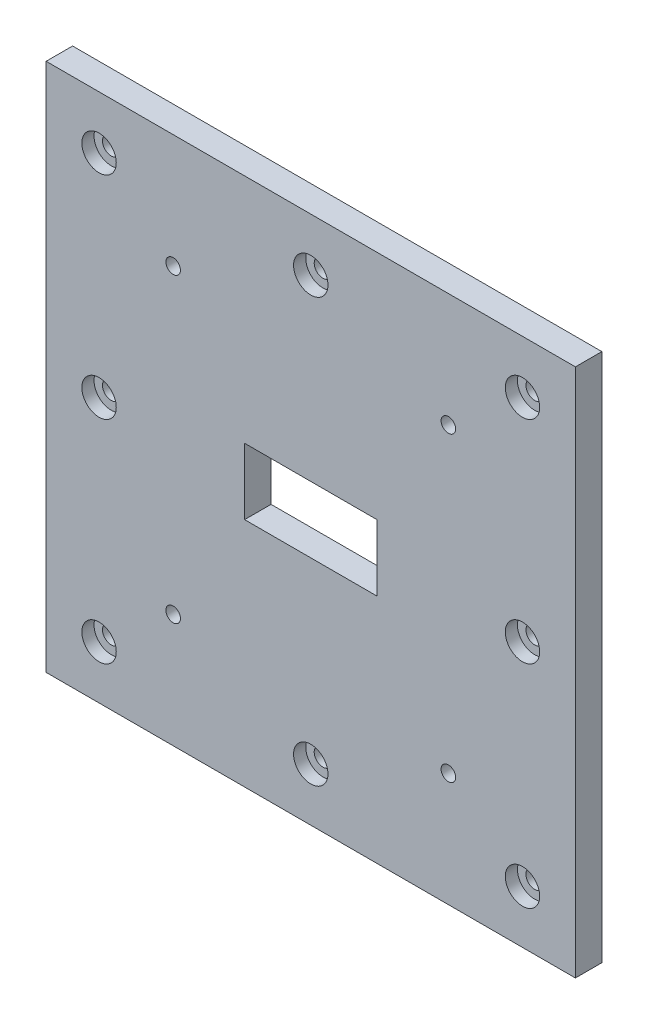
ISO-10303-21;
HEADER;
FILE_DESCRIPTION(('STEP AP214'),'2;1');
FILE_NAME('part.step','',(''),(''),'','','');
FILE_SCHEMA(('AUTOMOTIVE_DESIGN { 1 0 10303 214 1 1 1 1 }'));
ENDSEC;
DATA;
#1=APPLICATION_CONTEXT('core data for automotive mechanical design processes');
#2=APPLICATION_PROTOCOL_DEFINITION('international standard','automotive_design',2000,#1);
#3=PRODUCT_CONTEXT('',#1,'mechanical');
#4=PRODUCT('Part','Part','',(#3));
#5=PRODUCT_RELATED_PRODUCT_CATEGORY('part','',(#4));
#6=PRODUCT_DEFINITION_FORMATION('','',#4);
#7=PRODUCT_DEFINITION_CONTEXT('part definition',#1,'design');
#8=PRODUCT_DEFINITION('design','',#6,#7);
#9=PRODUCT_DEFINITION_SHAPE('','',#8);
#10=(LENGTH_UNIT() NAMED_UNIT(*) SI_UNIT(.MILLI.,.METRE.));
#11=(NAMED_UNIT(*) PLANE_ANGLE_UNIT() SI_UNIT($,.RADIAN.));
#12=(NAMED_UNIT(*) SI_UNIT($,.STERADIAN.) SOLID_ANGLE_UNIT());
#13=UNCERTAINTY_MEASURE_WITH_UNIT(LENGTH_MEASURE(1.E-05),#10,'distance_accuracy_value','');
#14=(GEOMETRIC_REPRESENTATION_CONTEXT(3) GLOBAL_UNCERTAINTY_ASSIGNED_CONTEXT((#13)) GLOBAL_UNIT_ASSIGNED_CONTEXT((#10,
#11,#12)) REPRESENTATION_CONTEXT('',''));
#15=CARTESIAN_POINT('',(0.,0.,0.));
#16=DIRECTION('',(0.,0.,1.));
#17=DIRECTION('',(1.,0.,0.));
#18=AXIS2_PLACEMENT_3D('',#15,#16,#17);
#19=CARTESIAN_POINT('',(0.,0.,5.));
#20=DIRECTION('',(0.,0.,1.));
#21=DIRECTION('',(1.,0.,0.));
#22=AXIS2_PLACEMENT_3D('',#19,#20,#21);
#23=PLANE('',#22);
#24=CARTESIAN_POINT('',(52.,57.,5.));
#25=DIRECTION('',(0.,0.,-1.));
#26=DIRECTION('',(-1.,0.,0.));
#27=AXIS2_PLACEMENT_3D('',#24,#25,#26);
#28=CIRCLE('',#27,2.75);
#29=CARTESIAN_POINT('',(49.25,57.,5.));
#30=VERTEX_POINT('',#29);
#31=EDGE_CURVE('E305',#30,#30,#28,.T.);
#32=ORIENTED_EDGE('',*,*,#31,.T.);
#33=EDGE_LOOP('',(#32));
#34=FACE_BOUND('',#33,.T.);
#35=CARTESIAN_POINT('',(-52.,57.,5.));
#36=DIRECTION('',(0.,0.,-1.));
#37=DIRECTION('',(-1.,0.,0.));
#38=AXIS2_PLACEMENT_3D('',#35,#36,#37);
#39=CIRCLE('',#38,2.75);
#40=CARTESIAN_POINT('',(-54.75,57.,5.));
#41=VERTEX_POINT('',#40);
#42=EDGE_CURVE('E296',#41,#41,#39,.T.);
#43=ORIENTED_EDGE('',*,*,#42,.T.);
#44=EDGE_LOOP('',(#43));
#45=FACE_BOUND('',#44,.T.);
#46=CARTESIAN_POINT('',(-51.9999999999999,-57.,5.));
#47=DIRECTION('',(0.,0.,-1.));
#48=DIRECTION('',(-1.,0.,0.));
#49=AXIS2_PLACEMENT_3D('',#46,#47,#48);
#50=CIRCLE('',#49,2.75);
#51=CARTESIAN_POINT('',(-54.7499999999999,-57.,5.));
#52=VERTEX_POINT('',#51);
#53=EDGE_CURVE('E287',#52,#52,#50,.T.);
#54=ORIENTED_EDGE('',*,*,#53,.T.);
#55=EDGE_LOOP('',(#54));
#56=FACE_BOUND('',#55,.T.);
#57=DIRECTION('',(0.,-1.,0.));
#58=VECTOR('',#57,1.);
#59=CARTESIAN_POINT('',(-100.,-100.,5.));
#60=LINE('',#59,#58);
#61=CARTESIAN_POINT('',(-100.,100.,5.));
#62=VERTEX_POINT('',#61);
#63=CARTESIAN_POINT('',(-100.,-100.,5.));
#64=VERTEX_POINT('',#63);
#65=EDGE_CURVE('E137',#62,#64,#60,.T.);
#66=ORIENTED_EDGE('',*,*,#65,.T.);
#67=DIRECTION('',(1.,0.,0.));
#68=VECTOR('',#67,1.);
#69=CARTESIAN_POINT('',(100.,-100.,5.));
#70=LINE('',#69,#68);
#71=CARTESIAN_POINT('',(100.,-100.,5.));
#72=VERTEX_POINT('',#71);
#73=EDGE_CURVE('E142',#64,#72,#70,.T.);
#74=ORIENTED_EDGE('',*,*,#73,.T.);
#75=DIRECTION('',(0.,1.,0.));
#76=VECTOR('',#75,1.);
#77=CARTESIAN_POINT('',(100.,-100.,5.));
#78=LINE('',#77,#76);
#79=CARTESIAN_POINT('',(100.,100.,5.));
#80=VERTEX_POINT('',#79);
#81=EDGE_CURVE('E145',#72,#80,#78,.T.);
#82=ORIENTED_EDGE('',*,*,#81,.T.);
#83=DIRECTION('',(-1.,0.,0.));
#84=VECTOR('',#83,1.);
#85=CARTESIAN_POINT('',(100.,100.,5.));
#86=LINE('',#85,#84);
#87=EDGE_CURVE('E148',#80,#62,#86,.T.);
#88=ORIENTED_EDGE('',*,*,#87,.T.);
#89=EDGE_LOOP('',(#66,#74,#82,#88));
#90=FACE_BOUND('',#89,.T.);
#91=DIRECTION('',(0.,1.,0.));
#92=VECTOR('',#91,1.);
#93=CARTESIAN_POINT('',(25.,0.,5.));
#94=LINE('',#93,#92);
#95=CARTESIAN_POINT('',(25.,-12.5,5.));
#96=VERTEX_POINT('',#95);
#97=CARTESIAN_POINT('',(25.,12.5,5.));
#98=VERTEX_POINT('',#97);
#99=EDGE_CURVE('E13',#96,#98,#94,.T.);
#100=ORIENTED_EDGE('',*,*,#99,.F.);
#101=DIRECTION('',(1.,0.,0.));
#102=VECTOR('',#101,1.);
#103=CARTESIAN_POINT('',(0.,-12.5,5.));
#104=LINE('',#103,#102);
#105=CARTESIAN_POINT('',(-25.,-12.5,5.));
#106=VERTEX_POINT('',#105);
#107=EDGE_CURVE('E166',#106,#96,#104,.T.);
#108=ORIENTED_EDGE('',*,*,#107,.F.);
#109=DIRECTION('',(0.,-1.,0.));
#110=VECTOR('',#109,1.);
#111=CARTESIAN_POINT('',(-25.,0.,5.));
#112=LINE('',#111,#110);
#113=CARTESIAN_POINT('',(-25.,12.5,5.));
#114=VERTEX_POINT('',#113);
#115=EDGE_CURVE('E117',#114,#106,#112,.T.);
#116=ORIENTED_EDGE('',*,*,#115,.F.);
#117=DIRECTION('',(-1.,0.,0.));
#118=VECTOR('',#117,1.);
#119=CARTESIAN_POINT('',(0.,12.5,5.));
#120=LINE('',#119,#118);
#121=EDGE_CURVE('E55',#98,#114,#120,.T.);
#122=ORIENTED_EDGE('',*,*,#121,.F.);
#123=EDGE_LOOP('',(#100,#108,#116,#122));
#124=FACE_BOUND('',#123,.T.);
#125=CARTESIAN_POINT('',(-80.,80.,5.));
#126=DIRECTION('',(0.,0.,1.));
#127=DIRECTION('',(1.,0.,0.));
#128=AXIS2_PLACEMENT_3D('',#125,#126,#127);
#129=CIRCLE('',#128,6.49999999999999);
#130=CARTESIAN_POINT('',(-73.5,80.,5.));
#131=VERTEX_POINT('',#130);
#132=EDGE_CURVE('E191',#131,#131,#129,.T.);
#133=ORIENTED_EDGE('',*,*,#132,.F.);
#134=EDGE_LOOP('',(#133));
#135=FACE_BOUND('',#134,.T.);
#136=CARTESIAN_POINT('',(0.,-80.,5.));
#137=DIRECTION('',(0.,0.,1.));
#138=DIRECTION('',(1.,0.,0.));
#139=AXIS2_PLACEMENT_3D('',#136,#137,#138);
#140=CIRCLE('',#139,6.5);
#141=CARTESIAN_POINT('',(6.5,-80.,5.));
#142=VERTEX_POINT('',#141);
#143=EDGE_CURVE('E203',#142,#142,#140,.T.);
#144=ORIENTED_EDGE('',*,*,#143,.F.);
#145=EDGE_LOOP('',(#144));
#146=FACE_BOUND('',#145,.T.);
#147=CARTESIAN_POINT('',(0.,80.,5.));
#148=DIRECTION('',(0.,0.,1.));
#149=DIRECTION('',(1.,0.,0.));
#150=AXIS2_PLACEMENT_3D('',#147,#148,#149);
#151=CIRCLE('',#150,6.5);
#152=CARTESIAN_POINT('',(6.5,80.,5.));
#153=VERTEX_POINT('',#152);
#154=EDGE_CURVE('E215',#153,#153,#151,.T.);
#155=ORIENTED_EDGE('',*,*,#154,.F.);
#156=EDGE_LOOP('',(#155));
#157=FACE_BOUND('',#156,.T.);
#158=CARTESIAN_POINT('',(80.,-80.,5.));
#159=DIRECTION('',(0.,0.,1.));
#160=DIRECTION('',(1.,0.,0.));
#161=AXIS2_PLACEMENT_3D('',#158,#159,#160);
#162=CIRCLE('',#161,6.49999999999999);
#163=CARTESIAN_POINT('',(86.5,-80.,5.));
#164=VERTEX_POINT('',#163);
#165=EDGE_CURVE('E227',#164,#164,#162,.T.);
#166=ORIENTED_EDGE('',*,*,#165,.F.);
#167=EDGE_LOOP('',(#166));
#168=FACE_BOUND('',#167,.T.);
#169=CARTESIAN_POINT('',(80.,0.,5.));
#170=DIRECTION('',(0.,0.,1.));
#171=DIRECTION('',(1.,0.,0.));
#172=AXIS2_PLACEMENT_3D('',#169,#170,#171);
#173=CIRCLE('',#172,6.49999999999999);
#174=CARTESIAN_POINT('',(86.5,0.,5.));
#175=VERTEX_POINT('',#174);
#176=EDGE_CURVE('E239',#175,#175,#173,.T.);
#177=ORIENTED_EDGE('',*,*,#176,.F.);
#178=EDGE_LOOP('',(#177));
#179=FACE_BOUND('',#178,.T.);
#180=CARTESIAN_POINT('',(80.,80.,5.));
#181=DIRECTION('',(0.,0.,1.));
#182=DIRECTION('',(1.,0.,0.));
#183=AXIS2_PLACEMENT_3D('',#180,#181,#182);
#184=CIRCLE('',#183,6.49999999999999);
#185=CARTESIAN_POINT('',(86.5,80.,5.));
#186=VERTEX_POINT('',#185);
#187=EDGE_CURVE('E251',#186,#186,#184,.T.);
#188=ORIENTED_EDGE('',*,*,#187,.F.);
#189=EDGE_LOOP('',(#188));
#190=FACE_BOUND('',#189,.T.);
#191=CARTESIAN_POINT('',(-80.,-80.,5.));
#192=DIRECTION('',(0.,0.,1.));
#193=DIRECTION('',(1.,0.,0.));
#194=AXIS2_PLACEMENT_3D('',#191,#192,#193);
#195=CIRCLE('',#194,6.49999999999999);
#196=CARTESIAN_POINT('',(-73.5,-80.,5.));
#197=VERTEX_POINT('',#196);
#198=EDGE_CURVE('E263',#197,#197,#195,.T.);
#199=ORIENTED_EDGE('',*,*,#198,.F.);
#200=EDGE_LOOP('',(#199));
#201=FACE_BOUND('',#200,.T.);
#202=CARTESIAN_POINT('',(-80.,0.,5.));
#203=DIRECTION('',(0.,0.,1.));
#204=DIRECTION('',(1.,0.,0.));
#205=AXIS2_PLACEMENT_3D('',#202,#203,#204);
#206=CIRCLE('',#205,6.49999999999999);
#207=CARTESIAN_POINT('',(-73.5,0.,5.));
#208=VERTEX_POINT('',#207);
#209=EDGE_CURVE('E275',#208,#208,#206,.T.);
#210=ORIENTED_EDGE('',*,*,#209,.F.);
#211=EDGE_LOOP('',(#210));
#212=FACE_BOUND('',#211,.T.);
#213=CARTESIAN_POINT('',(52.,-56.9999999999999,5.));
#214=DIRECTION('',(0.,0.,-1.));
#215=DIRECTION('',(-1.,0.,0.));
#216=AXIS2_PLACEMENT_3D('',#213,#214,#215);
#217=CIRCLE('',#216,2.75);
#218=CARTESIAN_POINT('',(49.25,-56.9999999999999,5.));
#219=VERTEX_POINT('',#218);
#220=EDGE_CURVE('E278',#219,#219,#217,.T.);
#221=ORIENTED_EDGE('',*,*,#220,.T.);
#222=EDGE_LOOP('',(#221));
#223=FACE_BOUND('',#222,.T.);
#224=ADVANCED_FACE('F47',(#34,#45,#56,#90,#124,#135,#146,#157,#168,#179,#190,#201,#212,#223),
#23,.T.);
#225=CARTESIAN_POINT('',(-100.,-100.,-5.));
#226=DIRECTION('',(-1.,0.,0.));
#227=DIRECTION('',(0.,0.,1.));
#228=AXIS2_PLACEMENT_3D('',#225,#226,#227);
#229=PLANE('',#228);
#230=DIRECTION('',(0.,0.,1.));
#231=VECTOR('',#230,1.);
#232=CARTESIAN_POINT('',(-100.,-100.,-5.));
#233=LINE('',#232,#231);
#234=CARTESIAN_POINT('',(-100.,-100.,-5.));
#235=VERTEX_POINT('',#234);
#236=EDGE_CURVE('E163',#235,#64,#233,.T.);
#237=ORIENTED_EDGE('',*,*,#236,.T.);
#238=ORIENTED_EDGE('',*,*,#65,.F.);
#239=DIRECTION('',(0.,0.,1.));
#240=VECTOR('',#239,1.);
#241=CARTESIAN_POINT('',(-100.,100.,-5.));
#242=LINE('',#241,#240);
#243=CARTESIAN_POINT('',(-100.,100.,-5.));
#244=VERTEX_POINT('',#243);
#245=EDGE_CURVE('E164',#244,#62,#242,.T.);
#246=ORIENTED_EDGE('',*,*,#245,.F.);
#247=DIRECTION('',(0.,-1.,0.));
#248=VECTOR('',#247,1.);
#249=CARTESIAN_POINT('',(-100.,-100.,-5.));
#250=LINE('',#249,#248);
#251=EDGE_CURVE('E151',#244,#235,#250,.T.);
#252=ORIENTED_EDGE('',*,*,#251,.T.);
#253=EDGE_LOOP('',(#237,#238,#246,#252));
#254=FACE_BOUND('',#253,.T.);
#255=ADVANCED_FACE('F49',(#254),#229,.T.);
#256=CARTESIAN_POINT('',(100.,100.,-5.));
#257=DIRECTION('',(0.,1.,0.));
#258=DIRECTION('',(-1.,0.,0.));
#259=AXIS2_PLACEMENT_3D('',#256,#257,#258);
#260=PLANE('',#259);
#261=ORIENTED_EDGE('',*,*,#245,.T.);
#262=ORIENTED_EDGE('',*,*,#87,.F.);
#263=DIRECTION('',(0.,0.,1.));
#264=VECTOR('',#263,1.);
#265=CARTESIAN_POINT('',(100.,100.,-5.));
#266=LINE('',#265,#264);
#267=CARTESIAN_POINT('',(100.,100.,-5.));
#268=VERTEX_POINT('',#267);
#269=EDGE_CURVE('E167',#268,#80,#266,.T.);
#270=ORIENTED_EDGE('',*,*,#269,.F.);
#271=DIRECTION('',(-1.,0.,0.));
#272=VECTOR('',#271,1.);
#273=CARTESIAN_POINT('',(100.,100.,-5.));
#274=LINE('',#273,#272);
#275=EDGE_CURVE('E160',#268,#244,#274,.T.);
#276=ORIENTED_EDGE('',*,*,#275,.T.);
#277=EDGE_LOOP('',(#261,#262,#270,#276));
#278=FACE_BOUND('',#277,.T.);
#279=ADVANCED_FACE('F491',(#278),#260,.T.);
#280=CARTESIAN_POINT('',(100.,-100.,-5.));
#281=DIRECTION('',(1.,0.,0.));
#282=DIRECTION('',(0.,0.,-1.));
#283=AXIS2_PLACEMENT_3D('',#280,#281,#282);
#284=PLANE('',#283);
#285=ORIENTED_EDGE('',*,*,#269,.T.);
#286=ORIENTED_EDGE('',*,*,#81,.F.);
#287=DIRECTION('',(0.,0.,1.));
#288=VECTOR('',#287,1.);
#289=CARTESIAN_POINT('',(100.,-100.,-5.));
#290=LINE('',#289,#288);
#291=CARTESIAN_POINT('',(100.,-100.,-5.));
#292=VERTEX_POINT('',#291);
#293=EDGE_CURVE('E169',#292,#72,#290,.T.);
#294=ORIENTED_EDGE('',*,*,#293,.F.);
#295=DIRECTION('',(0.,1.,0.));
#296=VECTOR('',#295,1.);
#297=CARTESIAN_POINT('',(100.,-100.,-5.));
#298=LINE('',#297,#296);
#299=EDGE_CURVE('E157',#292,#268,#298,.T.);
#300=ORIENTED_EDGE('',*,*,#299,.T.);
#301=EDGE_LOOP('',(#285,#286,#294,#300));
#302=FACE_BOUND('',#301,.T.);
#303=ADVANCED_FACE('F494',(#302),#284,.T.);
#304=CARTESIAN_POINT('',(100.,-100.,-5.));
#305=DIRECTION('',(0.,-1.,0.));
#306=DIRECTION('',(1.,0.,0.));
#307=AXIS2_PLACEMENT_3D('',#304,#305,#306);
#308=PLANE('',#307);
#309=ORIENTED_EDGE('',*,*,#293,.T.);
#310=ORIENTED_EDGE('',*,*,#73,.F.);
#311=ORIENTED_EDGE('',*,*,#236,.F.);
#312=DIRECTION('',(1.,0.,0.));
#313=VECTOR('',#312,1.);
#314=CARTESIAN_POINT('',(100.,-100.,-5.));
#315=LINE('',#314,#313);
#316=EDGE_CURVE('E154',#235,#292,#315,.T.);
#317=ORIENTED_EDGE('',*,*,#316,.T.);
#318=EDGE_LOOP('',(#309,#310,#311,#317));
#319=FACE_BOUND('',#318,.T.);
#320=ADVANCED_FACE('F319',(#319),#308,.T.);
#321=CARTESIAN_POINT('',(0.,0.,-5.));
#322=DIRECTION('',(0.,0.,1.));
#323=DIRECTION('',(1.,0.,0.));
#324=AXIS2_PLACEMENT_3D('',#321,#322,#323);
#325=PLANE('',#324);
#326=CARTESIAN_POINT('',(52.,57.,-5.));
#327=DIRECTION('',(0.,0.,-1.));
#328=DIRECTION('',(-1.,0.,0.));
#329=AXIS2_PLACEMENT_3D('',#326,#327,#328);
#330=CIRCLE('',#329,5.6);
#331=CARTESIAN_POINT('',(46.4,57.,-5.));
#332=VERTEX_POINT('',#331);
#333=EDGE_CURVE('E311',#332,#332,#330,.T.);
#334=ORIENTED_EDGE('',*,*,#333,.F.);
#335=EDGE_LOOP('',(#334));
#336=FACE_BOUND('',#335,.T.);
#337=CARTESIAN_POINT('',(-52.,57.,-5.));
#338=DIRECTION('',(0.,0.,-1.));
#339=DIRECTION('',(-1.,0.,0.));
#340=AXIS2_PLACEMENT_3D('',#337,#338,#339);
#341=CIRCLE('',#340,5.6);
#342=CARTESIAN_POINT('',(-57.6,57.,-5.));
#343=VERTEX_POINT('',#342);
#344=EDGE_CURVE('E302',#343,#343,#341,.T.);
#345=ORIENTED_EDGE('',*,*,#344,.F.);
#346=EDGE_LOOP('',(#345));
#347=FACE_BOUND('',#346,.T.);
#348=CARTESIAN_POINT('',(-51.9999999999999,-57.,-5.));
#349=DIRECTION('',(0.,0.,-1.));
#350=DIRECTION('',(-1.,0.,0.));
#351=AXIS2_PLACEMENT_3D('',#348,#349,#350);
#352=CIRCLE('',#351,5.6);
#353=CARTESIAN_POINT('',(-57.5999999999999,-57.,-5.));
#354=VERTEX_POINT('',#353);
#355=EDGE_CURVE('E293',#354,#354,#352,.T.);
#356=ORIENTED_EDGE('',*,*,#355,.F.);
#357=EDGE_LOOP('',(#356));
#358=FACE_BOUND('',#357,.T.);
#359=CARTESIAN_POINT('',(52.,-56.9999999999999,-5.));
#360=DIRECTION('',(0.,0.,-1.));
#361=DIRECTION('',(-1.,0.,0.));
#362=AXIS2_PLACEMENT_3D('',#359,#360,#361);
#363=CIRCLE('',#362,5.6);
#364=CARTESIAN_POINT('',(46.4,-56.9999999999999,-5.));
#365=VERTEX_POINT('',#364);
#366=EDGE_CURVE('E284',#365,#365,#363,.T.);
#367=ORIENTED_EDGE('',*,*,#366,.F.);
#368=EDGE_LOOP('',(#367));
#369=FACE_BOUND('',#368,.T.);
#370=CARTESIAN_POINT('',(-80.,0.,-5.));
#371=DIRECTION('',(0.,0.,1.));
#372=DIRECTION('',(1.,0.,0.));
#373=AXIS2_PLACEMENT_3D('',#370,#371,#372);
#374=CIRCLE('',#373,3.3);
#375=CARTESIAN_POINT('',(-76.7,0.,-5.));
#376=VERTEX_POINT('',#375);
#377=EDGE_CURVE('E266',#376,#376,#374,.T.);
#378=ORIENTED_EDGE('',*,*,#377,.T.);
#379=EDGE_LOOP('',(#378));
#380=FACE_BOUND('',#379,.T.);
#381=CARTESIAN_POINT('',(-80.,-80.,-5.));
#382=DIRECTION('',(0.,0.,1.));
#383=DIRECTION('',(1.,0.,0.));
#384=AXIS2_PLACEMENT_3D('',#381,#382,#383);
#385=CIRCLE('',#384,3.3);
#386=CARTESIAN_POINT('',(-76.7,-80.,-5.));
#387=VERTEX_POINT('',#386);
#388=EDGE_CURVE('E254',#387,#387,#385,.T.);
#389=ORIENTED_EDGE('',*,*,#388,.T.);
#390=EDGE_LOOP('',(#389));
#391=FACE_BOUND('',#390,.T.);
#392=CARTESIAN_POINT('',(80.,80.,-5.));
#393=DIRECTION('',(0.,0.,1.));
#394=DIRECTION('',(1.,0.,0.));
#395=AXIS2_PLACEMENT_3D('',#392,#393,#394);
#396=CIRCLE('',#395,3.3);
#397=CARTESIAN_POINT('',(83.3,80.,-5.));
#398=VERTEX_POINT('',#397);
#399=EDGE_CURVE('E242',#398,#398,#396,.T.);
#400=ORIENTED_EDGE('',*,*,#399,.T.);
#401=EDGE_LOOP('',(#400));
#402=FACE_BOUND('',#401,.T.);
#403=CARTESIAN_POINT('',(80.,0.,-5.));
#404=DIRECTION('',(0.,0.,1.));
#405=DIRECTION('',(1.,0.,0.));
#406=AXIS2_PLACEMENT_3D('',#403,#404,#405);
#407=CIRCLE('',#406,3.3);
#408=CARTESIAN_POINT('',(83.3,0.,-5.));
#409=VERTEX_POINT('',#408);
#410=EDGE_CURVE('E230',#409,#409,#407,.T.);
#411=ORIENTED_EDGE('',*,*,#410,.T.);
#412=EDGE_LOOP('',(#411));
#413=FACE_BOUND('',#412,.T.);
#414=CARTESIAN_POINT('',(80.,-80.,-5.));
#415=DIRECTION('',(0.,0.,1.));
#416=DIRECTION('',(1.,0.,0.));
#417=AXIS2_PLACEMENT_3D('',#414,#415,#416);
#418=CIRCLE('',#417,3.3);
#419=CARTESIAN_POINT('',(83.3,-80.,-5.));
#420=VERTEX_POINT('',#419);
#421=EDGE_CURVE('E218',#420,#420,#418,.T.);
#422=ORIENTED_EDGE('',*,*,#421,.T.);
#423=EDGE_LOOP('',(#422));
#424=FACE_BOUND('',#423,.T.);
#425=CARTESIAN_POINT('',(0.,80.,-5.));
#426=DIRECTION('',(0.,0.,1.));
#427=DIRECTION('',(1.,0.,0.));
#428=AXIS2_PLACEMENT_3D('',#425,#426,#427);
#429=CIRCLE('',#428,3.3);
#430=CARTESIAN_POINT('',(3.3,80.,-5.));
#431=VERTEX_POINT('',#430);
#432=EDGE_CURVE('E206',#431,#431,#429,.T.);
#433=ORIENTED_EDGE('',*,*,#432,.T.);
#434=EDGE_LOOP('',(#433));
#435=FACE_BOUND('',#434,.T.);
#436=CARTESIAN_POINT('',(0.,-80.,-5.));
#437=DIRECTION('',(0.,0.,1.));
#438=DIRECTION('',(1.,0.,0.));
#439=AXIS2_PLACEMENT_3D('',#436,#437,#438);
#440=CIRCLE('',#439,3.3);
#441=CARTESIAN_POINT('',(3.3,-80.,-5.));
#442=VERTEX_POINT('',#441);
#443=EDGE_CURVE('E194',#442,#442,#440,.T.);
#444=ORIENTED_EDGE('',*,*,#443,.T.);
#445=EDGE_LOOP('',(#444));
#446=FACE_BOUND('',#445,.T.);
#447=CARTESIAN_POINT('',(-80.,80.,-5.));
#448=DIRECTION('',(0.,0.,1.));
#449=DIRECTION('',(1.,0.,0.));
#450=AXIS2_PLACEMENT_3D('',#447,#448,#449);
#451=CIRCLE('',#450,3.3);
#452=CARTESIAN_POINT('',(-76.7,80.,-5.));
#453=VERTEX_POINT('',#452);
#454=EDGE_CURVE('E181',#453,#453,#451,.T.);
#455=ORIENTED_EDGE('',*,*,#454,.T.);
#456=EDGE_LOOP('',(#455));
#457=FACE_BOUND('',#456,.T.);
#458=DIRECTION('',(-1.,0.,0.));
#459=VECTOR('',#458,1.);
#460=CARTESIAN_POINT('',(-25.,-12.5,-5.));
#461=LINE('',#460,#459);
#462=CARTESIAN_POINT('',(25.,-12.5,-5.));
#463=VERTEX_POINT('',#462);
#464=CARTESIAN_POINT('',(-25.,-12.5,-5.));
#465=VERTEX_POINT('',#464);
#466=EDGE_CURVE('E123',#463,#465,#461,.T.);
#467=ORIENTED_EDGE('',*,*,#466,.F.);
#468=DIRECTION('',(0.,-1.,0.));
#469=VECTOR('',#468,1.);
#470=CARTESIAN_POINT('',(25.,-12.5,-5.));
#471=LINE('',#470,#469);
#472=CARTESIAN_POINT('',(25.,12.5,-5.));
#473=VERTEX_POINT('',#472);
#474=EDGE_CURVE('E62',#473,#463,#471,.T.);
#475=ORIENTED_EDGE('',*,*,#474,.F.);
#476=DIRECTION('',(1.,0.,0.));
#477=VECTOR('',#476,1.);
#478=CARTESIAN_POINT('',(-25.,12.5,-5.));
#479=LINE('',#478,#477);
#480=CARTESIAN_POINT('',(-25.,12.5,-5.));
#481=VERTEX_POINT('',#480);
#482=EDGE_CURVE('E130',#481,#473,#479,.T.);
#483=ORIENTED_EDGE('',*,*,#482,.F.);
#484=DIRECTION('',(0.,1.,0.));
#485=VECTOR('',#484,1.);
#486=CARTESIAN_POINT('',(-25.,-12.5,-5.));
#487=LINE('',#486,#485);
#488=EDGE_CURVE('E114',#465,#481,#487,.T.);
#489=ORIENTED_EDGE('',*,*,#488,.F.);
#490=EDGE_LOOP('',(#467,#475,#483,#489));
#491=FACE_BOUND('',#490,.T.);
#492=ORIENTED_EDGE('',*,*,#251,.F.);
#493=ORIENTED_EDGE('',*,*,#275,.F.);
#494=ORIENTED_EDGE('',*,*,#299,.F.);
#495=ORIENTED_EDGE('',*,*,#316,.F.);
#496=EDGE_LOOP('',(#492,#493,#494,#495));
#497=FACE_BOUND('',#496,.T.);
#498=ADVANCED_FACE('F127',(#336,#347,#358,#369,#380,#391,#402,#413,#424,#435,#446,#457,#491,
#497),#325,.F.);
#499=CARTESIAN_POINT('',(25.,-12.5,15.));
#500=DIRECTION('',(1.,0.,0.));
#501=DIRECTION('',(0.,0.,-1.));
#502=AXIS2_PLACEMENT_3D('',#499,#500,#501);
#503=PLANE('',#502);
#504=ORIENTED_EDGE('',*,*,#99,.T.);
#505=DIRECTION('',(0.,0.,-1.));
#506=VECTOR('',#505,1.);
#507=CARTESIAN_POINT('',(25.,12.5,15.));
#508=LINE('',#507,#506);
#509=EDGE_CURVE('E135',#98,#473,#508,.T.);
#510=ORIENTED_EDGE('',*,*,#509,.T.);
#511=ORIENTED_EDGE('',*,*,#474,.T.);
#512=DIRECTION('',(0.,0.,-1.));
#513=VECTOR('',#512,1.);
#514=CARTESIAN_POINT('',(25.,-12.5,15.));
#515=LINE('',#514,#513);
#516=EDGE_CURVE('E120',#96,#463,#515,.T.);
#517=ORIENTED_EDGE('',*,*,#516,.F.);
#518=EDGE_LOOP('',(#504,#510,#511,#517));
#519=FACE_BOUND('',#518,.T.);
#520=ADVANCED_FACE('F180',(#519),#503,.F.);
#521=CARTESIAN_POINT('',(-25.,12.5,15.));
#522=DIRECTION('',(0.,1.,0.));
#523=DIRECTION('',(-1.,0.,0.));
#524=AXIS2_PLACEMENT_3D('',#521,#522,#523);
#525=PLANE('',#524);
#526=ORIENTED_EDGE('',*,*,#121,.T.);
#527=DIRECTION('',(0.,0.,-1.));
#528=VECTOR('',#527,1.);
#529=CARTESIAN_POINT('',(-25.,12.5,15.));
#530=LINE('',#529,#528);
#531=EDGE_CURVE('E119',#114,#481,#530,.T.);
#532=ORIENTED_EDGE('',*,*,#531,.T.);
#533=ORIENTED_EDGE('',*,*,#482,.T.);
#534=ORIENTED_EDGE('',*,*,#509,.F.);
#535=EDGE_LOOP('',(#526,#532,#533,#534));
#536=FACE_BOUND('',#535,.T.);
#537=ADVANCED_FACE('F176',(#536),#525,.F.);
#538=CARTESIAN_POINT('',(-25.,-12.5,15.));
#539=DIRECTION('',(-1.,0.,0.));
#540=DIRECTION('',(0.,0.,1.));
#541=AXIS2_PLACEMENT_3D('',#538,#539,#540);
#542=PLANE('',#541);
#543=ORIENTED_EDGE('',*,*,#115,.T.);
#544=DIRECTION('',(0.,0.,-1.));
#545=VECTOR('',#544,1.);
#546=CARTESIAN_POINT('',(-25.,-12.5,15.));
#547=LINE('',#546,#545);
#548=EDGE_CURVE('E70',#106,#465,#547,.T.);
#549=ORIENTED_EDGE('',*,*,#548,.T.);
#550=ORIENTED_EDGE('',*,*,#488,.T.);
#551=ORIENTED_EDGE('',*,*,#531,.F.);
#552=EDGE_LOOP('',(#543,#549,#550,#551));
#553=FACE_BOUND('',#552,.T.);
#554=ADVANCED_FACE('F111',(#553),#542,.F.);
#555=CARTESIAN_POINT('',(-25.,-12.5,15.));
#556=DIRECTION('',(0.,-1.,0.));
#557=DIRECTION('',(1.,0.,0.));
#558=AXIS2_PLACEMENT_3D('',#555,#556,#557);
#559=PLANE('',#558);
#560=ORIENTED_EDGE('',*,*,#107,.T.);
#561=ORIENTED_EDGE('',*,*,#516,.T.);
#562=ORIENTED_EDGE('',*,*,#466,.T.);
#563=ORIENTED_EDGE('',*,*,#548,.F.);
#564=EDGE_LOOP('',(#560,#561,#562,#563));
#565=FACE_BOUND('',#564,.T.);
#566=ADVANCED_FACE('F124',(#565),#559,.F.);
#567=CARTESIAN_POINT('',(-80.,80.,5.));
#568=DIRECTION('',(0.,0.,1.));
#569=DIRECTION('',(1.,0.,0.));
#570=AXIS2_PLACEMENT_3D('',#567,#568,#569);
#571=CYLINDRICAL_SURFACE('',#570,3.3);
#572=ORIENTED_EDGE('',*,*,#454,.F.);
#573=EDGE_LOOP('',(#572));
#574=FACE_BOUND('',#573,.T.);
#575=CARTESIAN_POINT('',(-80.,80.,0.400000000000011));
#576=DIRECTION('',(0.,0.,1.));
#577=DIRECTION('',(1.,0.,0.));
#578=AXIS2_PLACEMENT_3D('',#575,#576,#577);
#579=CIRCLE('',#578,3.30000000000001);
#580=CARTESIAN_POINT('',(-76.7,80.,0.400000000000011));
#581=VERTEX_POINT('',#580);
#582=EDGE_CURVE('E183',#581,#581,#579,.T.);
#583=ORIENTED_EDGE('',*,*,#582,.T.);
#584=EDGE_LOOP('',(#583));
#585=FACE_BOUND('',#584,.T.);
#586=ADVANCED_FACE('F343',(#574,#585),#571,.F.);
#587=CARTESIAN_POINT('',(-76.7,80.,0.400000000000011));
#588=DIRECTION('',(0.,0.,-1.));
#589=DIRECTION('',(-1.,0.,0.));
#590=AXIS2_PLACEMENT_3D('',#587,#588,#589);
#591=PLANE('',#590);
#592=ORIENTED_EDGE('',*,*,#582,.F.);
#593=EDGE_LOOP('',(#592));
#594=FACE_BOUND('',#593,.T.);
#595=CARTESIAN_POINT('',(-80.,80.,0.400000000000011));
#596=DIRECTION('',(0.,0.,1.));
#597=DIRECTION('',(1.,0.,0.));
#598=AXIS2_PLACEMENT_3D('',#595,#596,#597);
#599=CIRCLE('',#598,6.49999999999999);
#600=CARTESIAN_POINT('',(-73.5,80.,0.400000000000011));
#601=VERTEX_POINT('',#600);
#602=EDGE_CURVE('E188',#601,#601,#599,.T.);
#603=ORIENTED_EDGE('',*,*,#602,.T.);
#604=EDGE_LOOP('',(#603));
#605=FACE_BOUND('',#604,.T.);
#606=ADVANCED_FACE('F346',(#594,#605),#591,.F.);
#607=CARTESIAN_POINT('',(-80.,80.,5.));
#608=DIRECTION('',(0.,0.,1.));
#609=DIRECTION('',(1.,0.,0.));
#610=AXIS2_PLACEMENT_3D('',#607,#608,#609);
#611=CYLINDRICAL_SURFACE('',#610,6.49999999999999);
#612=ORIENTED_EDGE('',*,*,#602,.F.);
#613=EDGE_LOOP('',(#612));
#614=FACE_BOUND('',#613,.T.);
#615=ORIENTED_EDGE('',*,*,#132,.T.);
#616=EDGE_LOOP('',(#615));
#617=FACE_BOUND('',#616,.T.);
#618=ADVANCED_FACE('F352',(#614,#617),#611,.F.);
#619=CARTESIAN_POINT('',(0.,-80.,5.));
#620=DIRECTION('',(0.,0.,1.));
#621=DIRECTION('',(1.,0.,0.));
#622=AXIS2_PLACEMENT_3D('',#619,#620,#621);
#623=CYLINDRICAL_SURFACE('',#622,3.30000000000001);
#624=ORIENTED_EDGE('',*,*,#443,.F.);
#625=EDGE_LOOP('',(#624));
#626=FACE_BOUND('',#625,.T.);
#627=CARTESIAN_POINT('',(0.,-80.,0.400000000000011));
#628=DIRECTION('',(0.,0.,1.));
#629=DIRECTION('',(1.,0.,0.));
#630=AXIS2_PLACEMENT_3D('',#627,#628,#629);
#631=CIRCLE('',#630,3.30000000000001);
#632=CARTESIAN_POINT('',(3.30000000000001,-80.,0.400000000000011));
#633=VERTEX_POINT('',#632);
#634=EDGE_CURVE('E197',#633,#633,#631,.T.);
#635=ORIENTED_EDGE('',*,*,#634,.T.);
#636=EDGE_LOOP('',(#635));
#637=FACE_BOUND('',#636,.T.);
#638=ADVANCED_FACE('F358',(#626,#637),#623,.F.);
#639=CARTESIAN_POINT('',(3.30000000000001,-80.,0.400000000000011));
#640=DIRECTION('',(0.,0.,-1.));
#641=DIRECTION('',(-1.,0.,0.));
#642=AXIS2_PLACEMENT_3D('',#639,#640,#641);
#643=PLANE('',#642);
#644=ORIENTED_EDGE('',*,*,#634,.F.);
#645=EDGE_LOOP('',(#644));
#646=FACE_BOUND('',#645,.T.);
#647=CARTESIAN_POINT('',(0.,-80.,0.400000000000011));
#648=DIRECTION('',(0.,0.,1.));
#649=DIRECTION('',(1.,0.,0.));
#650=AXIS2_PLACEMENT_3D('',#647,#648,#649);
#651=CIRCLE('',#650,6.5);
#652=CARTESIAN_POINT('',(6.5,-80.,0.400000000000011));
#653=VERTEX_POINT('',#652);
#654=EDGE_CURVE('E200',#653,#653,#651,.T.);
#655=ORIENTED_EDGE('',*,*,#654,.T.);
#656=EDGE_LOOP('',(#655));
#657=FACE_BOUND('',#656,.T.);
#658=ADVANCED_FACE('F475',(#646,#657),#643,.F.);
#659=CARTESIAN_POINT('',(0.,-80.,5.));
#660=DIRECTION('',(0.,0.,1.));
#661=DIRECTION('',(1.,0.,0.));
#662=AXIS2_PLACEMENT_3D('',#659,#660,#661);
#663=CYLINDRICAL_SURFACE('',#662,6.5);
#664=ORIENTED_EDGE('',*,*,#654,.F.);
#665=EDGE_LOOP('',(#664));
#666=FACE_BOUND('',#665,.T.);
#667=ORIENTED_EDGE('',*,*,#143,.T.);
#668=EDGE_LOOP('',(#667));
#669=FACE_BOUND('',#668,.T.);
#670=ADVANCED_FACE('F471',(#666,#669),#663,.F.);
#671=CARTESIAN_POINT('',(0.,80.,5.));
#672=DIRECTION('',(0.,0.,1.));
#673=DIRECTION('',(1.,0.,0.));
#674=AXIS2_PLACEMENT_3D('',#671,#672,#673);
#675=CYLINDRICAL_SURFACE('',#674,3.30000000000001);
#676=ORIENTED_EDGE('',*,*,#432,.F.);
#677=EDGE_LOOP('',(#676));
#678=FACE_BOUND('',#677,.T.);
#679=CARTESIAN_POINT('',(0.,80.,0.400000000000011));
#680=DIRECTION('',(0.,0.,1.));
#681=DIRECTION('',(1.,0.,0.));
#682=AXIS2_PLACEMENT_3D('',#679,#680,#681);
#683=CIRCLE('',#682,3.30000000000001);
#684=CARTESIAN_POINT('',(3.30000000000001,80.,0.400000000000011));
#685=VERTEX_POINT('',#684);
#686=EDGE_CURVE('E209',#685,#685,#683,.T.);
#687=ORIENTED_EDGE('',*,*,#686,.T.);
#688=EDGE_LOOP('',(#687));
#689=FACE_BOUND('',#688,.T.);
#690=ADVANCED_FACE('F467',(#678,#689),#675,.F.);
#691=CARTESIAN_POINT('',(3.30000000000001,80.,0.400000000000011));
#692=DIRECTION('',(0.,0.,-1.));
#693=DIRECTION('',(-1.,0.,0.));
#694=AXIS2_PLACEMENT_3D('',#691,#692,#693);
#695=PLANE('',#694);
#696=ORIENTED_EDGE('',*,*,#686,.F.);
#697=EDGE_LOOP('',(#696));
#698=FACE_BOUND('',#697,.T.);
#699=CARTESIAN_POINT('',(0.,80.,0.400000000000011));
#700=DIRECTION('',(0.,0.,1.));
#701=DIRECTION('',(1.,0.,0.));
#702=AXIS2_PLACEMENT_3D('',#699,#700,#701);
#703=CIRCLE('',#702,6.5);
#704=CARTESIAN_POINT('',(6.5,80.,0.400000000000011));
#705=VERTEX_POINT('',#704);
#706=EDGE_CURVE('E212',#705,#705,#703,.T.);
#707=ORIENTED_EDGE('',*,*,#706,.T.);
#708=EDGE_LOOP('',(#707));
#709=FACE_BOUND('',#708,.T.);
#710=ADVANCED_FACE('F463',(#698,#709),#695,.F.);
#711=CARTESIAN_POINT('',(0.,80.,5.));
#712=DIRECTION('',(0.,0.,1.));
#713=DIRECTION('',(1.,0.,0.));
#714=AXIS2_PLACEMENT_3D('',#711,#712,#713);
#715=CYLINDRICAL_SURFACE('',#714,6.5);
#716=ORIENTED_EDGE('',*,*,#706,.F.);
#717=EDGE_LOOP('',(#716));
#718=FACE_BOUND('',#717,.T.);
#719=ORIENTED_EDGE('',*,*,#154,.T.);
#720=EDGE_LOOP('',(#719));
#721=FACE_BOUND('',#720,.T.);
#722=ADVANCED_FACE('F459',(#718,#721),#715,.F.);
#723=CARTESIAN_POINT('',(80.,-80.,5.));
#724=DIRECTION('',(0.,0.,1.));
#725=DIRECTION('',(1.,0.,0.));
#726=AXIS2_PLACEMENT_3D('',#723,#724,#725);
#727=CYLINDRICAL_SURFACE('',#726,3.3);
#728=ORIENTED_EDGE('',*,*,#421,.F.);
#729=EDGE_LOOP('',(#728));
#730=FACE_BOUND('',#729,.T.);
#731=CARTESIAN_POINT('',(80.,-80.,0.400000000000011));
#732=DIRECTION('',(0.,0.,1.));
#733=DIRECTION('',(1.,0.,0.));
#734=AXIS2_PLACEMENT_3D('',#731,#732,#733);
#735=CIRCLE('',#734,3.30000000000001);
#736=CARTESIAN_POINT('',(83.3,-80.,0.400000000000011));
#737=VERTEX_POINT('',#736);
#738=EDGE_CURVE('E221',#737,#737,#735,.T.);
#739=ORIENTED_EDGE('',*,*,#738,.T.);
#740=EDGE_LOOP('',(#739));
#741=FACE_BOUND('',#740,.T.);
#742=ADVANCED_FACE('F455',(#730,#741),#727,.F.);
#743=CARTESIAN_POINT('',(83.3,-80.,0.400000000000011));
#744=DIRECTION('',(0.,0.,-1.));
#745=DIRECTION('',(-1.,0.,0.));
#746=AXIS2_PLACEMENT_3D('',#743,#744,#745);
#747=PLANE('',#746);
#748=ORIENTED_EDGE('',*,*,#738,.F.);
#749=EDGE_LOOP('',(#748));
#750=FACE_BOUND('',#749,.T.);
#751=CARTESIAN_POINT('',(80.,-80.,0.400000000000011));
#752=DIRECTION('',(0.,0.,1.));
#753=DIRECTION('',(1.,0.,0.));
#754=AXIS2_PLACEMENT_3D('',#751,#752,#753);
#755=CIRCLE('',#754,6.49999999999999);
#756=CARTESIAN_POINT('',(86.5,-80.,0.400000000000011));
#757=VERTEX_POINT('',#756);
#758=EDGE_CURVE('E224',#757,#757,#755,.T.);
#759=ORIENTED_EDGE('',*,*,#758,.T.);
#760=EDGE_LOOP('',(#759));
#761=FACE_BOUND('',#760,.T.);
#762=ADVANCED_FACE('F451',(#750,#761),#747,.F.);
#763=CARTESIAN_POINT('',(80.,-80.,5.));
#764=DIRECTION('',(0.,0.,1.));
#765=DIRECTION('',(1.,0.,0.));
#766=AXIS2_PLACEMENT_3D('',#763,#764,#765);
#767=CYLINDRICAL_SURFACE('',#766,6.49999999999999);
#768=ORIENTED_EDGE('',*,*,#758,.F.);
#769=EDGE_LOOP('',(#768));
#770=FACE_BOUND('',#769,.T.);
#771=ORIENTED_EDGE('',*,*,#165,.T.);
#772=EDGE_LOOP('',(#771));
#773=FACE_BOUND('',#772,.T.);
#774=ADVANCED_FACE('F447',(#770,#773),#767,.F.);
#775=CARTESIAN_POINT('',(80.,0.,5.));
#776=DIRECTION('',(0.,0.,1.));
#777=DIRECTION('',(1.,0.,0.));
#778=AXIS2_PLACEMENT_3D('',#775,#776,#777);
#779=CYLINDRICAL_SURFACE('',#778,3.3);
#780=ORIENTED_EDGE('',*,*,#410,.F.);
#781=EDGE_LOOP('',(#780));
#782=FACE_BOUND('',#781,.T.);
#783=CARTESIAN_POINT('',(80.,0.,0.400000000000011));
#784=DIRECTION('',(0.,0.,1.));
#785=DIRECTION('',(1.,0.,0.));
#786=AXIS2_PLACEMENT_3D('',#783,#784,#785);
#787=CIRCLE('',#786,3.30000000000001);
#788=CARTESIAN_POINT('',(83.3,0.,0.400000000000011));
#789=VERTEX_POINT('',#788);
#790=EDGE_CURVE('E233',#789,#789,#787,.T.);
#791=ORIENTED_EDGE('',*,*,#790,.T.);
#792=EDGE_LOOP('',(#791));
#793=FACE_BOUND('',#792,.T.);
#794=ADVANCED_FACE('F443',(#782,#793),#779,.F.);
#795=CARTESIAN_POINT('',(83.3,0.,0.400000000000011));
#796=DIRECTION('',(0.,0.,-1.));
#797=DIRECTION('',(-1.,0.,0.));
#798=AXIS2_PLACEMENT_3D('',#795,#796,#797);
#799=PLANE('',#798);
#800=ORIENTED_EDGE('',*,*,#790,.F.);
#801=EDGE_LOOP('',(#800));
#802=FACE_BOUND('',#801,.T.);
#803=CARTESIAN_POINT('',(80.,0.,0.400000000000011));
#804=DIRECTION('',(0.,0.,1.));
#805=DIRECTION('',(1.,0.,0.));
#806=AXIS2_PLACEMENT_3D('',#803,#804,#805);
#807=CIRCLE('',#806,6.49999999999999);
#808=CARTESIAN_POINT('',(86.5,0.,0.400000000000011));
#809=VERTEX_POINT('',#808);
#810=EDGE_CURVE('E236',#809,#809,#807,.T.);
#811=ORIENTED_EDGE('',*,*,#810,.T.);
#812=EDGE_LOOP('',(#811));
#813=FACE_BOUND('',#812,.T.);
#814=ADVANCED_FACE('F439',(#802,#813),#799,.F.);
#815=CARTESIAN_POINT('',(80.,0.,5.));
#816=DIRECTION('',(0.,0.,1.));
#817=DIRECTION('',(1.,0.,0.));
#818=AXIS2_PLACEMENT_3D('',#815,#816,#817);
#819=CYLINDRICAL_SURFACE('',#818,6.49999999999999);
#820=ORIENTED_EDGE('',*,*,#810,.F.);
#821=EDGE_LOOP('',(#820));
#822=FACE_BOUND('',#821,.T.);
#823=ORIENTED_EDGE('',*,*,#176,.T.);
#824=EDGE_LOOP('',(#823));
#825=FACE_BOUND('',#824,.T.);
#826=ADVANCED_FACE('F435',(#822,#825),#819,.F.);
#827=CARTESIAN_POINT('',(80.,80.,5.));
#828=DIRECTION('',(0.,0.,1.));
#829=DIRECTION('',(1.,0.,0.));
#830=AXIS2_PLACEMENT_3D('',#827,#828,#829);
#831=CYLINDRICAL_SURFACE('',#830,3.3);
#832=ORIENTED_EDGE('',*,*,#399,.F.);
#833=EDGE_LOOP('',(#832));
#834=FACE_BOUND('',#833,.T.);
#835=CARTESIAN_POINT('',(80.,80.,0.400000000000011));
#836=DIRECTION('',(0.,0.,1.));
#837=DIRECTION('',(1.,0.,0.));
#838=AXIS2_PLACEMENT_3D('',#835,#836,#837);
#839=CIRCLE('',#838,3.30000000000001);
#840=CARTESIAN_POINT('',(83.3,80.,0.400000000000011));
#841=VERTEX_POINT('',#840);
#842=EDGE_CURVE('E245',#841,#841,#839,.T.);
#843=ORIENTED_EDGE('',*,*,#842,.T.);
#844=EDGE_LOOP('',(#843));
#845=FACE_BOUND('',#844,.T.);
#846=ADVANCED_FACE('F431',(#834,#845),#831,.F.);
#847=CARTESIAN_POINT('',(83.3,80.,0.400000000000011));
#848=DIRECTION('',(0.,0.,-1.));
#849=DIRECTION('',(-1.,0.,0.));
#850=AXIS2_PLACEMENT_3D('',#847,#848,#849);
#851=PLANE('',#850);
#852=ORIENTED_EDGE('',*,*,#842,.F.);
#853=EDGE_LOOP('',(#852));
#854=FACE_BOUND('',#853,.T.);
#855=CARTESIAN_POINT('',(80.,80.,0.400000000000011));
#856=DIRECTION('',(0.,0.,1.));
#857=DIRECTION('',(1.,0.,0.));
#858=AXIS2_PLACEMENT_3D('',#855,#856,#857);
#859=CIRCLE('',#858,6.49999999999999);
#860=CARTESIAN_POINT('',(86.5,80.,0.400000000000011));
#861=VERTEX_POINT('',#860);
#862=EDGE_CURVE('E248',#861,#861,#859,.T.);
#863=ORIENTED_EDGE('',*,*,#862,.T.);
#864=EDGE_LOOP('',(#863));
#865=FACE_BOUND('',#864,.T.);
#866=ADVANCED_FACE('F427',(#854,#865),#851,.F.);
#867=CARTESIAN_POINT('',(80.,80.,5.));
#868=DIRECTION('',(0.,0.,1.));
#869=DIRECTION('',(1.,0.,0.));
#870=AXIS2_PLACEMENT_3D('',#867,#868,#869);
#871=CYLINDRICAL_SURFACE('',#870,6.49999999999999);
#872=ORIENTED_EDGE('',*,*,#862,.F.);
#873=EDGE_LOOP('',(#872));
#874=FACE_BOUND('',#873,.T.);
#875=ORIENTED_EDGE('',*,*,#187,.T.);
#876=EDGE_LOOP('',(#875));
#877=FACE_BOUND('',#876,.T.);
#878=ADVANCED_FACE('F423',(#874,#877),#871,.F.);
#879=CARTESIAN_POINT('',(-80.,-80.,5.));
#880=DIRECTION('',(0.,0.,1.));
#881=DIRECTION('',(1.,0.,0.));
#882=AXIS2_PLACEMENT_3D('',#879,#880,#881);
#883=CYLINDRICAL_SURFACE('',#882,3.3);
#884=ORIENTED_EDGE('',*,*,#388,.F.);
#885=EDGE_LOOP('',(#884));
#886=FACE_BOUND('',#885,.T.);
#887=CARTESIAN_POINT('',(-80.,-80.,0.400000000000011));
#888=DIRECTION('',(0.,0.,1.));
#889=DIRECTION('',(1.,0.,0.));
#890=AXIS2_PLACEMENT_3D('',#887,#888,#889);
#891=CIRCLE('',#890,3.30000000000001);
#892=CARTESIAN_POINT('',(-76.7,-80.,0.400000000000011));
#893=VERTEX_POINT('',#892);
#894=EDGE_CURVE('E257',#893,#893,#891,.T.);
#895=ORIENTED_EDGE('',*,*,#894,.T.);
#896=EDGE_LOOP('',(#895));
#897=FACE_BOUND('',#896,.T.);
#898=ADVANCED_FACE('F419',(#886,#897),#883,.F.);
#899=CARTESIAN_POINT('',(-76.7,-80.,0.400000000000011));
#900=DIRECTION('',(0.,0.,-1.));
#901=DIRECTION('',(-1.,0.,0.));
#902=AXIS2_PLACEMENT_3D('',#899,#900,#901);
#903=PLANE('',#902);
#904=ORIENTED_EDGE('',*,*,#894,.F.);
#905=EDGE_LOOP('',(#904));
#906=FACE_BOUND('',#905,.T.);
#907=CARTESIAN_POINT('',(-80.,-80.,0.400000000000011));
#908=DIRECTION('',(0.,0.,1.));
#909=DIRECTION('',(1.,0.,0.));
#910=AXIS2_PLACEMENT_3D('',#907,#908,#909);
#911=CIRCLE('',#910,6.49999999999999);
#912=CARTESIAN_POINT('',(-73.5,-80.,0.400000000000011));
#913=VERTEX_POINT('',#912);
#914=EDGE_CURVE('E260',#913,#913,#911,.T.);
#915=ORIENTED_EDGE('',*,*,#914,.T.);
#916=EDGE_LOOP('',(#915));
#917=FACE_BOUND('',#916,.T.);
#918=ADVANCED_FACE('F415',(#906,#917),#903,.F.);
#919=CARTESIAN_POINT('',(-80.,-80.,5.));
#920=DIRECTION('',(0.,0.,1.));
#921=DIRECTION('',(1.,0.,0.));
#922=AXIS2_PLACEMENT_3D('',#919,#920,#921);
#923=CYLINDRICAL_SURFACE('',#922,6.49999999999999);
#924=ORIENTED_EDGE('',*,*,#914,.F.);
#925=EDGE_LOOP('',(#924));
#926=FACE_BOUND('',#925,.T.);
#927=ORIENTED_EDGE('',*,*,#198,.T.);
#928=EDGE_LOOP('',(#927));
#929=FACE_BOUND('',#928,.T.);
#930=ADVANCED_FACE('F411',(#926,#929),#923,.F.);
#931=CARTESIAN_POINT('',(-80.,0.,5.));
#932=DIRECTION('',(0.,0.,1.));
#933=DIRECTION('',(1.,0.,0.));
#934=AXIS2_PLACEMENT_3D('',#931,#932,#933);
#935=CYLINDRICAL_SURFACE('',#934,3.3);
#936=ORIENTED_EDGE('',*,*,#377,.F.);
#937=EDGE_LOOP('',(#936));
#938=FACE_BOUND('',#937,.T.);
#939=CARTESIAN_POINT('',(-80.,0.,0.400000000000011));
#940=DIRECTION('',(0.,0.,1.));
#941=DIRECTION('',(1.,0.,0.));
#942=AXIS2_PLACEMENT_3D('',#939,#940,#941);
#943=CIRCLE('',#942,3.30000000000001);
#944=CARTESIAN_POINT('',(-76.7,0.,0.400000000000011));
#945=VERTEX_POINT('',#944);
#946=EDGE_CURVE('E269',#945,#945,#943,.T.);
#947=ORIENTED_EDGE('',*,*,#946,.T.);
#948=EDGE_LOOP('',(#947));
#949=FACE_BOUND('',#948,.T.);
#950=ADVANCED_FACE('F407',(#938,#949),#935,.F.);
#951=CARTESIAN_POINT('',(-76.7,0.,0.400000000000011));
#952=DIRECTION('',(0.,0.,-1.));
#953=DIRECTION('',(-1.,0.,0.));
#954=AXIS2_PLACEMENT_3D('',#951,#952,#953);
#955=PLANE('',#954);
#956=ORIENTED_EDGE('',*,*,#946,.F.);
#957=EDGE_LOOP('',(#956));
#958=FACE_BOUND('',#957,.T.);
#959=CARTESIAN_POINT('',(-80.,0.,0.400000000000011));
#960=DIRECTION('',(0.,0.,1.));
#961=DIRECTION('',(1.,0.,0.));
#962=AXIS2_PLACEMENT_3D('',#959,#960,#961);
#963=CIRCLE('',#962,6.49999999999999);
#964=CARTESIAN_POINT('',(-73.5,0.,0.400000000000011));
#965=VERTEX_POINT('',#964);
#966=EDGE_CURVE('E272',#965,#965,#963,.T.);
#967=ORIENTED_EDGE('',*,*,#966,.T.);
#968=EDGE_LOOP('',(#967));
#969=FACE_BOUND('',#968,.T.);
#970=ADVANCED_FACE('F403',(#958,#969),#955,.F.);
#971=CARTESIAN_POINT('',(-80.,0.,5.));
#972=DIRECTION('',(0.,0.,1.));
#973=DIRECTION('',(1.,0.,0.));
#974=AXIS2_PLACEMENT_3D('',#971,#972,#973);
#975=CYLINDRICAL_SURFACE('',#974,6.49999999999999);
#976=ORIENTED_EDGE('',*,*,#966,.F.);
#977=EDGE_LOOP('',(#976));
#978=FACE_BOUND('',#977,.T.);
#979=ORIENTED_EDGE('',*,*,#209,.T.);
#980=EDGE_LOOP('',(#979));
#981=FACE_BOUND('',#980,.T.);
#982=ADVANCED_FACE('F385',(#978,#981),#975,.F.);
#983=CARTESIAN_POINT('',(52.,-56.9999999999999,-5.));
#984=DIRECTION('',(0.,0.,-1.));
#985=DIRECTION('',(-1.,0.,0.));
#986=AXIS2_PLACEMENT_3D('',#983,#984,#985);
#987=CYLINDRICAL_SURFACE('',#986,2.75);
#988=ORIENTED_EDGE('',*,*,#220,.F.);
#989=EDGE_LOOP('',(#988));
#990=FACE_BOUND('',#989,.T.);
#991=CARTESIAN_POINT('',(52.,-56.9999999999999,-2.14999999999999));
#992=DIRECTION('',(0.,0.,-1.));
#993=DIRECTION('',(-1.,0.,0.));
#994=AXIS2_PLACEMENT_3D('',#991,#992,#993);
#995=CIRCLE('',#994,2.75);
#996=CARTESIAN_POINT('',(49.25,-56.9999999999999,-2.14999999999999));
#997=VERTEX_POINT('',#996);
#998=EDGE_CURVE('E281',#997,#997,#995,.T.);
#999=ORIENTED_EDGE('',*,*,#998,.T.);
#1000=EDGE_LOOP('',(#999));
#1001=FACE_BOUND('',#1000,.T.);
#1002=ADVANCED_FACE('F381',(#990,#1001),#987,.F.);
#1003=CARTESIAN_POINT('',(52.,-56.9999999999999,-5.));
#1004=DIRECTION('',(0.,0.,-1.));
#1005=DIRECTION('',(-1.,0.,0.));
#1006=AXIS2_PLACEMENT_3D('',#1003,#1004,#1005);
#1007=CONICAL_SURFACE('',#1006,5.6,0.78539816339745);
#1008=ORIENTED_EDGE('',*,*,#998,.F.);
#1009=EDGE_LOOP('',(#1008));
#1010=FACE_BOUND('',#1009,.T.);
#1011=ORIENTED_EDGE('',*,*,#366,.T.);
#1012=EDGE_LOOP('',(#1011));
#1013=FACE_BOUND('',#1012,.T.);
#1014=ADVANCED_FACE('F384',(#1010,#1013),#1007,.F.);
#1015=CARTESIAN_POINT('',(-51.9999999999999,-57.,-5.));
#1016=DIRECTION('',(0.,0.,-1.));
#1017=DIRECTION('',(-1.,0.,0.));
#1018=AXIS2_PLACEMENT_3D('',#1015,#1016,#1017);
#1019=CYLINDRICAL_SURFACE('',#1018,2.75);
#1020=ORIENTED_EDGE('',*,*,#53,.F.);
#1021=EDGE_LOOP('',(#1020));
#1022=FACE_BOUND('',#1021,.T.);
#1023=CARTESIAN_POINT('',(-51.9999999999999,-57.,-2.14999999999999));
#1024=DIRECTION('',(0.,0.,-1.));
#1025=DIRECTION('',(-1.,0.,0.));
#1026=AXIS2_PLACEMENT_3D('',#1023,#1024,#1025);
#1027=CIRCLE('',#1026,2.75);
#1028=CARTESIAN_POINT('',(-54.7499999999999,-57.,-2.14999999999999));
#1029=VERTEX_POINT('',#1028);
#1030=EDGE_CURVE('E290',#1029,#1029,#1027,.T.);
#1031=ORIENTED_EDGE('',*,*,#1030,.T.);
#1032=EDGE_LOOP('',(#1031));
#1033=FACE_BOUND('',#1032,.T.);
#1034=ADVANCED_FACE('F391',(#1022,#1033),#1019,.F.);
#1035=CARTESIAN_POINT('',(-51.9999999999999,-57.,-5.));
#1036=DIRECTION('',(0.,0.,-1.));
#1037=DIRECTION('',(-1.,0.,0.));
#1038=AXIS2_PLACEMENT_3D('',#1035,#1036,#1037);
#1039=CONICAL_SURFACE('',#1038,5.6,0.78539816339745);
#1040=ORIENTED_EDGE('',*,*,#1030,.F.);
#1041=EDGE_LOOP('',(#1040));
#1042=FACE_BOUND('',#1041,.T.);
#1043=ORIENTED_EDGE('',*,*,#355,.T.);
#1044=EDGE_LOOP('',(#1043));
#1045=FACE_BOUND('',#1044,.T.);
#1046=ADVANCED_FACE('F396',(#1042,#1045),#1039,.F.);
#1047=CARTESIAN_POINT('',(-52.,57.,-5.));
#1048=DIRECTION('',(0.,0.,-1.));
#1049=DIRECTION('',(-1.,0.,0.));
#1050=AXIS2_PLACEMENT_3D('',#1047,#1048,#1049);
#1051=CYLINDRICAL_SURFACE('',#1050,2.75);
#1052=ORIENTED_EDGE('',*,*,#42,.F.);
#1053=EDGE_LOOP('',(#1052));
#1054=FACE_BOUND('',#1053,.T.);
#1055=CARTESIAN_POINT('',(-52.,57.,-2.14999999999999));
#1056=DIRECTION('',(0.,0.,-1.));
#1057=DIRECTION('',(-1.,0.,0.));
#1058=AXIS2_PLACEMENT_3D('',#1055,#1056,#1057);
#1059=CIRCLE('',#1058,2.75);
#1060=CARTESIAN_POINT('',(-54.75,57.,-2.14999999999999));
#1061=VERTEX_POINT('',#1060);
#1062=EDGE_CURVE('E299',#1061,#1061,#1059,.T.);
#1063=ORIENTED_EDGE('',*,*,#1062,.T.);
#1064=EDGE_LOOP('',(#1063));
#1065=FACE_BOUND('',#1064,.T.);
#1066=ADVANCED_FACE('F662',(#1054,#1065),#1051,.F.);
#1067=CARTESIAN_POINT('',(-52.,57.,-5.));
#1068=DIRECTION('',(0.,0.,-1.));
#1069=DIRECTION('',(-1.,0.,0.));
#1070=AXIS2_PLACEMENT_3D('',#1067,#1068,#1069);
#1071=CONICAL_SURFACE('',#1070,5.6,0.78539816339745);
#1072=ORIENTED_EDGE('',*,*,#1062,.F.);
#1073=EDGE_LOOP('',(#1072));
#1074=FACE_BOUND('',#1073,.T.);
#1075=ORIENTED_EDGE('',*,*,#344,.T.);
#1076=EDGE_LOOP('',(#1075));
#1077=FACE_BOUND('',#1076,.T.);
#1078=ADVANCED_FACE('F669',(#1074,#1077),#1071,.F.);
#1079=CARTESIAN_POINT('',(52.,57.,-5.));
#1080=DIRECTION('',(0.,0.,-1.));
#1081=DIRECTION('',(-1.,0.,0.));
#1082=AXIS2_PLACEMENT_3D('',#1079,#1080,#1081);
#1083=CYLINDRICAL_SURFACE('',#1082,2.75);
#1084=ORIENTED_EDGE('',*,*,#31,.F.);
#1085=EDGE_LOOP('',(#1084));
#1086=FACE_BOUND('',#1085,.T.);
#1087=CARTESIAN_POINT('',(52.,57.,-2.14999999999999));
#1088=DIRECTION('',(0.,0.,-1.));
#1089=DIRECTION('',(-1.,0.,0.));
#1090=AXIS2_PLACEMENT_3D('',#1087,#1088,#1089);
#1091=CIRCLE('',#1090,2.75);
#1092=CARTESIAN_POINT('',(49.25,57.,-2.14999999999999));
#1093=VERTEX_POINT('',#1092);
#1094=EDGE_CURVE('E308',#1093,#1093,#1091,.T.);
#1095=ORIENTED_EDGE('',*,*,#1094,.T.);
#1096=EDGE_LOOP('',(#1095));
#1097=FACE_BOUND('',#1096,.T.);
#1098=ADVANCED_FACE('F677',(#1086,#1097),#1083,.F.);
#1099=CARTESIAN_POINT('',(52.,57.,-5.));
#1100=DIRECTION('',(0.,0.,-1.));
#1101=DIRECTION('',(-1.,0.,0.));
#1102=AXIS2_PLACEMENT_3D('',#1099,#1100,#1101);
#1103=CONICAL_SURFACE('',#1102,5.6,0.78539816339745);
#1104=ORIENTED_EDGE('',*,*,#1094,.F.);
#1105=EDGE_LOOP('',(#1104));
#1106=FACE_BOUND('',#1105,.T.);
#1107=ORIENTED_EDGE('',*,*,#333,.T.);
#1108=EDGE_LOOP('',(#1107));
#1109=FACE_BOUND('',#1108,.T.);
#1110=ADVANCED_FACE('F315',(#1106,#1109),#1103,.F.);
#1111=CLOSED_SHELL('',(#224,#255,#279,#303,#320,#498,#520,#537,#554,#566,#586,#606,#618,#638,
#658,#670,#690,#710,#722,#742,#762,#774,#794,#814,#826,#846,#866,#878,#898,#918,#930,#950,#970,
#982,#1002,#1014,#1034,#1046,#1066,#1078,#1098,#1110));
#1112=MANIFOLD_SOLID_BREP('B2',#1111);
#1113=ADVANCED_BREP_SHAPE_REPRESENTATION('',(#18,#1112),#14);
#1114=SHAPE_DEFINITION_REPRESENTATION(#9,#1113);
ENDSEC;
END-ISO-10303-21;
